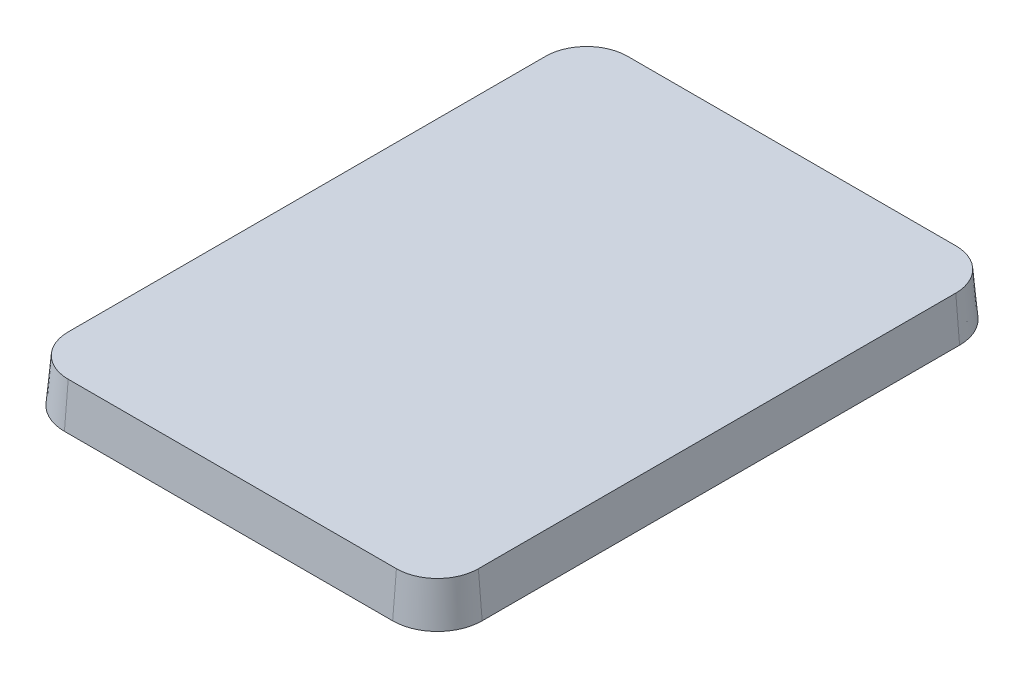
ISO-10303-21;
HEADER;
FILE_DESCRIPTION(('STEP AP214'),'2;1');
FILE_NAME('part.step','',(''),(''),'','','');
FILE_SCHEMA(('AUTOMOTIVE_DESIGN { 1 0 10303 214 1 1 1 1 }'));
ENDSEC;
DATA;
#1=APPLICATION_CONTEXT('core data for automotive mechanical design processes');
#2=APPLICATION_PROTOCOL_DEFINITION('international standard','automotive_design',2000,#1);
#3=PRODUCT_CONTEXT('',#1,'mechanical');
#4=PRODUCT('Part','Part','',(#3));
#5=PRODUCT_RELATED_PRODUCT_CATEGORY('part','',(#4));
#6=PRODUCT_DEFINITION_FORMATION('','',#4);
#7=PRODUCT_DEFINITION_CONTEXT('part definition',#1,'design');
#8=PRODUCT_DEFINITION('design','',#6,#7);
#9=PRODUCT_DEFINITION_SHAPE('','',#8);
#10=(LENGTH_UNIT() NAMED_UNIT(*) SI_UNIT(.MILLI.,.METRE.));
#11=(NAMED_UNIT(*) PLANE_ANGLE_UNIT() SI_UNIT($,.RADIAN.));
#12=(NAMED_UNIT(*) SI_UNIT($,.STERADIAN.) SOLID_ANGLE_UNIT());
#13=UNCERTAINTY_MEASURE_WITH_UNIT(LENGTH_MEASURE(1.E-05),#10,'distance_accuracy_value','');
#14=(GEOMETRIC_REPRESENTATION_CONTEXT(3) GLOBAL_UNCERTAINTY_ASSIGNED_CONTEXT((#13)) GLOBAL_UNIT_ASSIGNED_CONTEXT((#10,
#11,#12)) REPRESENTATION_CONTEXT('',''));
#15=CARTESIAN_POINT('',(0.,0.,0.));
#16=DIRECTION('',(0.,0.,1.));
#17=DIRECTION('',(1.,0.,0.));
#18=AXIS2_PLACEMENT_3D('',#15,#16,#17);
#19=CARTESIAN_POINT('',(22.,0.,-32.));
#20=DIRECTION('',(0.,-1.,0.));
#21=DIRECTION('',(0.,0.,-1.));
#22=AXIS2_PLACEMENT_3D('',#19,#20,#21);
#23=CONICAL_SURFACE('',#22,6.,0.0872664625997167);
#24=CARTESIAN_POINT('',(22.,0.,-32.));
#25=DIRECTION('',(0.,1.,0.));
#26=DIRECTION('',(0.,0.,-1.));
#27=AXIS2_PLACEMENT_3D('',#24,#25,#26);
#28=CIRCLE('',#27,6.);
#29=CARTESIAN_POINT('',(28.,0.,-32.));
#30=VERTEX_POINT('',#29);
#31=CARTESIAN_POINT('',(22.,0.,-38.));
#32=VERTEX_POINT('',#31);
#33=EDGE_CURVE('E103',#30,#32,#28,.T.);
#34=ORIENTED_EDGE('',*,*,#33,.T.);
#35=DIRECTION('',(0.,-0.996194698091745,-0.0871557427476584));
#36=VECTOR('',#35,1.);
#37=CARTESIAN_POINT('',(22.,0.,-38.));
#38=LINE('',#37,#36);
#39=CARTESIAN_POINT('',(22.,5.8,-37.4925657515496));
#40=VERTEX_POINT('',#39);
#41=EDGE_CURVE('E11',#40,#32,#38,.T.);
#42=ORIENTED_EDGE('',*,*,#41,.F.);
#43=CARTESIAN_POINT('',(22.,5.8,-32.));
#44=DIRECTION('',(0.,-1.,0.));
#45=DIRECTION('',(0.,0.,-1.));
#46=AXIS2_PLACEMENT_3D('',#43,#44,#45);
#47=CIRCLE('',#46,5.49256575154964);
#48=CARTESIAN_POINT('',(27.4925657515496,5.8,-32.));
#49=VERTEX_POINT('',#48);
#50=EDGE_CURVE('E128',#49,#40,#47,.F.);
#51=ORIENTED_EDGE('',*,*,#50,.F.);
#52=DIRECTION('',(0.0871557427476584,-0.996194698091745,0.));
#53=VECTOR('',#52,1.);
#54=CARTESIAN_POINT('',(28.,0.,-32.));
#55=LINE('',#54,#53);
#56=EDGE_CURVE('E115',#49,#30,#55,.T.);
#57=ORIENTED_EDGE('',*,*,#56,.T.);
#58=EDGE_LOOP('',(#34,#42,#51,#57));
#59=FACE_BOUND('',#58,.T.);
#60=ADVANCED_FACE('F33',(#59),#23,.T.);
#61=CARTESIAN_POINT('',(-22.,0.,-38.));
#62=DIRECTION('',(0.,0.0871557427476584,-0.996194698091746));
#63=DIRECTION('',(0.,0.996194698091746,0.0871557427476584));
#64=AXIS2_PLACEMENT_3D('',#61,#62,#63);
#65=PLANE('',#64);
#66=DIRECTION('',(-1.,0.,0.));
#67=VECTOR('',#66,1.);
#68=CARTESIAN_POINT('',(-22.,0.,-38.));
#69=LINE('',#68,#67);
#70=CARTESIAN_POINT('',(-22.,0.,-38.));
#71=VERTEX_POINT('',#70);
#72=EDGE_CURVE('E99',#32,#71,#69,.T.);
#73=ORIENTED_EDGE('',*,*,#72,.T.);
#74=DIRECTION('',(0.,-0.996194698091745,-0.0871557427476584));
#75=VECTOR('',#74,1.);
#76=CARTESIAN_POINT('',(-22.,0.,-38.));
#77=LINE('',#76,#75);
#78=CARTESIAN_POINT('',(-22.,5.8,-37.4925657515496));
#79=VERTEX_POINT('',#78);
#80=EDGE_CURVE('E42',#79,#71,#77,.T.);
#81=ORIENTED_EDGE('',*,*,#80,.F.);
#82=DIRECTION('',(1.,0.,0.));
#83=VECTOR('',#82,1.);
#84=CARTESIAN_POINT('',(22.,5.8,-37.4925657515496));
#85=LINE('',#84,#83);
#86=EDGE_CURVE('E111',#40,#79,#85,.F.);
#87=ORIENTED_EDGE('',*,*,#86,.F.);
#88=ORIENTED_EDGE('',*,*,#41,.T.);
#89=EDGE_LOOP('',(#73,#81,#87,#88));
#90=FACE_BOUND('',#89,.T.);
#91=ADVANCED_FACE('F35',(#90),#65,.T.);
#92=CARTESIAN_POINT('',(-22.,0.,-32.));
#93=DIRECTION('',(0.,-1.,0.));
#94=DIRECTION('',(0.,0.,1.));
#95=AXIS2_PLACEMENT_3D('',#92,#93,#94);
#96=CONICAL_SURFACE('',#95,6.,0.0872664625997167);
#97=CARTESIAN_POINT('',(-22.,0.,-32.));
#98=DIRECTION('',(0.,1.,0.));
#99=DIRECTION('',(0.,0.,1.));
#100=AXIS2_PLACEMENT_3D('',#97,#98,#99);
#101=CIRCLE('',#100,6.);
#102=CARTESIAN_POINT('',(-28.,0.,-32.));
#103=VERTEX_POINT('',#102);
#104=EDGE_CURVE('E105',#71,#103,#101,.T.);
#105=ORIENTED_EDGE('',*,*,#104,.T.);
#106=DIRECTION('',(-0.0871557427476584,-0.996194698091745,0.));
#107=VECTOR('',#106,1.);
#108=CARTESIAN_POINT('',(-28.,0.,-32.));
#109=LINE('',#108,#107);
#110=CARTESIAN_POINT('',(-27.4925657515497,5.8,-32.));
#111=VERTEX_POINT('',#110);
#112=EDGE_CURVE('E143',#111,#103,#109,.T.);
#113=ORIENTED_EDGE('',*,*,#112,.F.);
#114=CARTESIAN_POINT('',(-22.,5.8,-32.));
#115=DIRECTION('',(0.,-1.,0.));
#116=DIRECTION('',(0.,0.,-1.));
#117=AXIS2_PLACEMENT_3D('',#114,#115,#116);
#118=CIRCLE('',#117,5.49256575154964);
#119=EDGE_CURVE('E149',#79,#111,#118,.F.);
#120=ORIENTED_EDGE('',*,*,#119,.F.);
#121=ORIENTED_EDGE('',*,*,#80,.T.);
#122=EDGE_LOOP('',(#105,#113,#120,#121));
#123=FACE_BOUND('',#122,.T.);
#124=ADVANCED_FACE('F172',(#123),#96,.T.);
#125=CARTESIAN_POINT('',(-28.,0.,-32.));
#126=DIRECTION('',(-0.996194698091746,0.0871557427476584,0.));
#127=DIRECTION('',(-0.0871557427476584,-0.996194698091746,0.));
#128=AXIS2_PLACEMENT_3D('',#125,#126,#127);
#129=PLANE('',#128);
#130=DIRECTION('',(0.,0.,1.));
#131=VECTOR('',#130,1.);
#132=CARTESIAN_POINT('',(-28.,0.,-32.));
#133=LINE('',#132,#131);
#134=CARTESIAN_POINT('',(-28.,0.,32.));
#135=VERTEX_POINT('',#134);
#136=EDGE_CURVE('E119',#103,#135,#133,.T.);
#137=ORIENTED_EDGE('',*,*,#136,.T.);
#138=DIRECTION('',(-0.0871557427476584,-0.996194698091745,0.));
#139=VECTOR('',#138,1.);
#140=CARTESIAN_POINT('',(-28.,0.,32.));
#141=LINE('',#140,#139);
#142=CARTESIAN_POINT('',(-27.4925657515496,5.8,32.));
#143=VERTEX_POINT('',#142);
#144=EDGE_CURVE('E140',#143,#135,#141,.T.);
#145=ORIENTED_EDGE('',*,*,#144,.F.);
#146=DIRECTION('',(0.,0.,-1.));
#147=VECTOR('',#146,1.);
#148=CARTESIAN_POINT('',(-27.4925657515497,5.8,-32.));
#149=LINE('',#148,#147);
#150=EDGE_CURVE('E151',#111,#143,#149,.F.);
#151=ORIENTED_EDGE('',*,*,#150,.F.);
#152=ORIENTED_EDGE('',*,*,#112,.T.);
#153=EDGE_LOOP('',(#137,#145,#151,#152));
#154=FACE_BOUND('',#153,.T.);
#155=ADVANCED_FACE('F176',(#154),#129,.T.);
#156=CARTESIAN_POINT('',(-22.,0.,32.));
#157=DIRECTION('',(0.,-1.,0.));
#158=DIRECTION('',(0.,0.,1.));
#159=AXIS2_PLACEMENT_3D('',#156,#157,#158);
#160=CONICAL_SURFACE('',#159,6.,0.0872664625997167);
#161=CARTESIAN_POINT('',(-22.,0.,32.));
#162=DIRECTION('',(0.,1.,0.));
#163=DIRECTION('',(0.,0.,1.));
#164=AXIS2_PLACEMENT_3D('',#161,#162,#163);
#165=CIRCLE('',#164,6.);
#166=CARTESIAN_POINT('',(-22.,0.,38.));
#167=VERTEX_POINT('',#166);
#168=EDGE_CURVE('E121',#135,#167,#165,.T.);
#169=ORIENTED_EDGE('',*,*,#168,.T.);
#170=DIRECTION('',(0.,-0.996194698091745,0.0871557427476584));
#171=VECTOR('',#170,1.);
#172=CARTESIAN_POINT('',(-22.,0.,38.));
#173=LINE('',#172,#171);
#174=CARTESIAN_POINT('',(-22.,5.8,37.4925657515496));
#175=VERTEX_POINT('',#174);
#176=EDGE_CURVE('E137',#175,#167,#173,.T.);
#177=ORIENTED_EDGE('',*,*,#176,.F.);
#178=CARTESIAN_POINT('',(-22.,5.8,32.));
#179=DIRECTION('',(0.,-1.,0.));
#180=DIRECTION('',(0.,0.,-1.));
#181=AXIS2_PLACEMENT_3D('',#178,#179,#180);
#182=CIRCLE('',#181,5.49256575154964);
#183=EDGE_CURVE('E153',#143,#175,#182,.F.);
#184=ORIENTED_EDGE('',*,*,#183,.F.);
#185=ORIENTED_EDGE('',*,*,#144,.T.);
#186=EDGE_LOOP('',(#169,#177,#184,#185));
#187=FACE_BOUND('',#186,.T.);
#188=ADVANCED_FACE('F179',(#187),#160,.T.);
#189=CARTESIAN_POINT('',(-22.,0.,38.));
#190=DIRECTION('',(0.,0.0871557427476584,0.996194698091746));
#191=DIRECTION('',(0.,-0.996194698091746,0.0871557427476584));
#192=AXIS2_PLACEMENT_3D('',#189,#190,#191);
#193=PLANE('',#192);
#194=DIRECTION('',(1.,0.,0.));
#195=VECTOR('',#194,1.);
#196=CARTESIAN_POINT('',(-22.,0.,38.));
#197=LINE('',#196,#195);
#198=CARTESIAN_POINT('',(22.,0.,38.));
#199=VERTEX_POINT('',#198);
#200=EDGE_CURVE('E123',#167,#199,#197,.T.);
#201=ORIENTED_EDGE('',*,*,#200,.T.);
#202=DIRECTION('',(0.,-0.996194698091745,0.0871557427476584));
#203=VECTOR('',#202,1.);
#204=CARTESIAN_POINT('',(22.,0.,38.));
#205=LINE('',#204,#203);
#206=CARTESIAN_POINT('',(22.,5.8,37.4925657515496));
#207=VERTEX_POINT('',#206);
#208=EDGE_CURVE('E134',#207,#199,#205,.T.);
#209=ORIENTED_EDGE('',*,*,#208,.F.);
#210=DIRECTION('',(-1.,0.,0.));
#211=VECTOR('',#210,1.);
#212=CARTESIAN_POINT('',(22.,5.8,37.4925657515497));
#213=LINE('',#212,#211);
#214=EDGE_CURVE('E155',#175,#207,#213,.F.);
#215=ORIENTED_EDGE('',*,*,#214,.F.);
#216=ORIENTED_EDGE('',*,*,#176,.T.);
#217=EDGE_LOOP('',(#201,#209,#215,#216));
#218=FACE_BOUND('',#217,.T.);
#219=ADVANCED_FACE('F162',(#218),#193,.T.);
#220=CARTESIAN_POINT('',(22.,0.,32.));
#221=DIRECTION('',(0.,-1.,0.));
#222=DIRECTION('',(0.,0.,1.));
#223=AXIS2_PLACEMENT_3D('',#220,#221,#222);
#224=CONICAL_SURFACE('',#223,6.,0.0872664625997167);
#225=CARTESIAN_POINT('',(22.,0.,32.));
#226=DIRECTION('',(0.,1.,0.));
#227=DIRECTION('',(0.,0.,1.));
#228=AXIS2_PLACEMENT_3D('',#225,#226,#227);
#229=CIRCLE('',#228,6.);
#230=CARTESIAN_POINT('',(28.,0.,32.));
#231=VERTEX_POINT('',#230);
#232=EDGE_CURVE('E125',#199,#231,#229,.T.);
#233=ORIENTED_EDGE('',*,*,#232,.T.);
#234=DIRECTION('',(0.0871557427476584,-0.996194698091745,0.));
#235=VECTOR('',#234,1.);
#236=CARTESIAN_POINT('',(28.,0.,32.));
#237=LINE('',#236,#235);
#238=CARTESIAN_POINT('',(27.4925657515496,5.8,32.));
#239=VERTEX_POINT('',#238);
#240=EDGE_CURVE('E131',#239,#231,#237,.T.);
#241=ORIENTED_EDGE('',*,*,#240,.F.);
#242=CARTESIAN_POINT('',(22.,5.8,32.));
#243=DIRECTION('',(0.,-1.,0.));
#244=DIRECTION('',(0.,0.,-1.));
#245=AXIS2_PLACEMENT_3D('',#242,#243,#244);
#246=CIRCLE('',#245,5.49256575154964);
#247=EDGE_CURVE('E54',#207,#239,#246,.F.);
#248=ORIENTED_EDGE('',*,*,#247,.F.);
#249=ORIENTED_EDGE('',*,*,#208,.T.);
#250=EDGE_LOOP('',(#233,#241,#248,#249));
#251=FACE_BOUND('',#250,.T.);
#252=ADVANCED_FACE('F166',(#251),#224,.T.);
#253=CARTESIAN_POINT('',(28.,0.,-32.));
#254=DIRECTION('',(0.996194698091746,0.0871557427476584,0.));
#255=DIRECTION('',(-0.0871557427476584,0.996194698091746,0.));
#256=AXIS2_PLACEMENT_3D('',#253,#254,#255);
#257=PLANE('',#256);
#258=DIRECTION('',(0.,0.,-1.));
#259=VECTOR('',#258,1.);
#260=CARTESIAN_POINT('',(28.,0.,-32.));
#261=LINE('',#260,#259);
#262=EDGE_CURVE('E127',#231,#30,#261,.T.);
#263=ORIENTED_EDGE('',*,*,#262,.T.);
#264=ORIENTED_EDGE('',*,*,#56,.F.);
#265=DIRECTION('',(0.,0.,1.));
#266=VECTOR('',#265,1.);
#267=CARTESIAN_POINT('',(27.4925657515496,5.8,-32.));
#268=LINE('',#267,#266);
#269=EDGE_CURVE('E37',#239,#49,#268,.F.);
#270=ORIENTED_EDGE('',*,*,#269,.F.);
#271=ORIENTED_EDGE('',*,*,#240,.T.);
#272=EDGE_LOOP('',(#263,#264,#270,#271));
#273=FACE_BOUND('',#272,.T.);
#274=ADVANCED_FACE('F168',(#273),#257,.T.);
#275=CARTESIAN_POINT('',(22.,5.8,-32.));
#276=DIRECTION('',(0.,-1.,0.));
#277=DIRECTION('',(0.,0.,-1.));
#278=AXIS2_PLACEMENT_3D('',#275,#276,#277);
#279=PLANE('',#278);
#280=ORIENTED_EDGE('',*,*,#50,.T.);
#281=ORIENTED_EDGE('',*,*,#86,.T.);
#282=ORIENTED_EDGE('',*,*,#119,.T.);
#283=ORIENTED_EDGE('',*,*,#150,.T.);
#284=ORIENTED_EDGE('',*,*,#183,.T.);
#285=ORIENTED_EDGE('',*,*,#214,.T.);
#286=ORIENTED_EDGE('',*,*,#247,.T.);
#287=ORIENTED_EDGE('',*,*,#269,.T.);
#288=EDGE_LOOP('',(#280,#281,#282,#283,#284,#285,#286,#287));
#289=FACE_BOUND('',#288,.T.);
#290=ADVANCED_FACE('F158',(#289),#279,.F.);
#291=CARTESIAN_POINT('',(22.,0.,-32.));
#292=DIRECTION('',(0.,-1.,0.));
#293=DIRECTION('',(0.,0.,-1.));
#294=AXIS2_PLACEMENT_3D('',#291,#292,#293);
#295=PLANE('',#294);
#296=ORIENTED_EDGE('',*,*,#33,.F.);
#297=ORIENTED_EDGE('',*,*,#262,.F.);
#298=ORIENTED_EDGE('',*,*,#232,.F.);
#299=ORIENTED_EDGE('',*,*,#200,.F.);
#300=ORIENTED_EDGE('',*,*,#168,.F.);
#301=ORIENTED_EDGE('',*,*,#136,.F.);
#302=ORIENTED_EDGE('',*,*,#104,.F.);
#303=ORIENTED_EDGE('',*,*,#72,.F.);
#304=EDGE_LOOP('',(#296,#297,#298,#299,#300,#301,#302,#303));
#305=FACE_BOUND('',#304,.T.);
#306=ADVANCED_FACE('F100',(#305),#295,.T.);
#307=CLOSED_SHELL('',(#60,#91,#124,#155,#188,#219,#252,#274,#290,#306));
#308=MANIFOLD_SOLID_BREP('B2',#307);
#309=ADVANCED_BREP_SHAPE_REPRESENTATION('',(#18,#308),#14);
#310=SHAPE_DEFINITION_REPRESENTATION(#9,#309);
ENDSEC;
END-ISO-10303-21;
